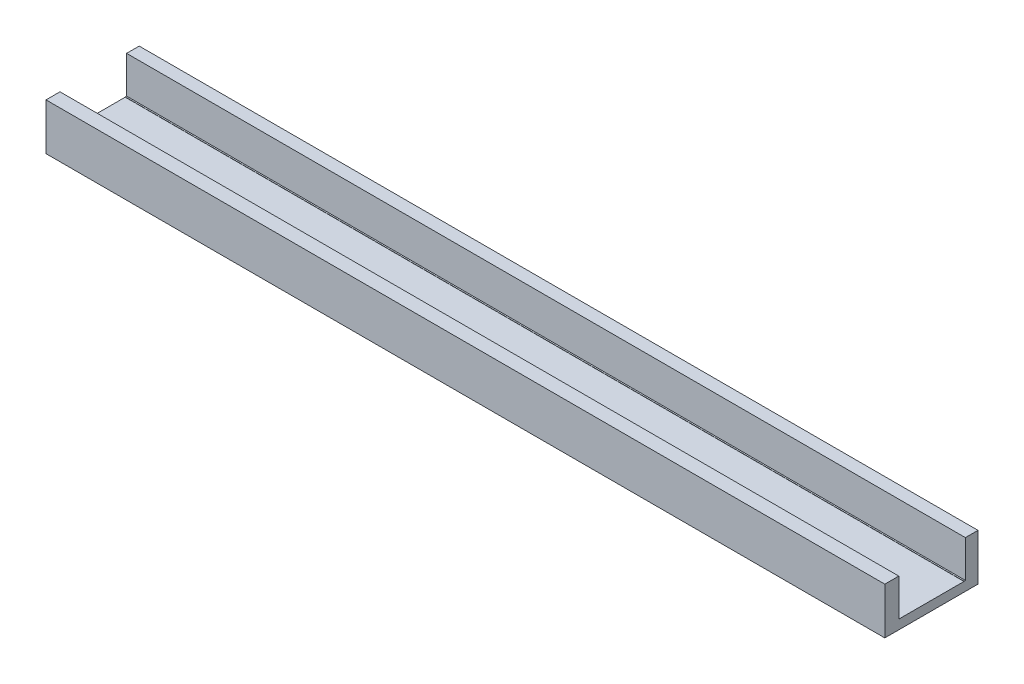
ISO-10303-21;
HEADER;
FILE_DESCRIPTION(('STEP AP214'),'2;1');
FILE_NAME('part.step','',(''),(''),'','','');
FILE_SCHEMA(('AUTOMOTIVE_DESIGN { 1 0 10303 214 1 1 1 1 }'));
ENDSEC;
DATA;
#1=APPLICATION_CONTEXT('core data for automotive mechanical design processes');
#2=APPLICATION_PROTOCOL_DEFINITION('international standard','automotive_design',2000,#1);
#3=PRODUCT_CONTEXT('',#1,'mechanical');
#4=PRODUCT('Part','Part','',(#3));
#5=PRODUCT_RELATED_PRODUCT_CATEGORY('part','',(#4));
#6=PRODUCT_DEFINITION_FORMATION('','',#4);
#7=PRODUCT_DEFINITION_CONTEXT('part definition',#1,'design');
#8=PRODUCT_DEFINITION('design','',#6,#7);
#9=PRODUCT_DEFINITION_SHAPE('','',#8);
#10=(LENGTH_UNIT() NAMED_UNIT(*) SI_UNIT(.MILLI.,.METRE.));
#11=(NAMED_UNIT(*) PLANE_ANGLE_UNIT() SI_UNIT($,.RADIAN.));
#12=(NAMED_UNIT(*) SI_UNIT($,.STERADIAN.) SOLID_ANGLE_UNIT());
#13=UNCERTAINTY_MEASURE_WITH_UNIT(LENGTH_MEASURE(1.E-05),#10,'distance_accuracy_value','');
#14=(GEOMETRIC_REPRESENTATION_CONTEXT(3) GLOBAL_UNCERTAINTY_ASSIGNED_CONTEXT((#13)) GLOBAL_UNIT_ASSIGNED_CONTEXT((#10,
#11,#12)) REPRESENTATION_CONTEXT('',''));
#15=CARTESIAN_POINT('',(0.,0.,0.));
#16=DIRECTION('',(0.,0.,1.));
#17=DIRECTION('',(1.,0.,0.));
#18=AXIS2_PLACEMENT_3D('',#15,#16,#17);
#19=CARTESIAN_POINT('',(-900.,-80.,30.));
#20=DIRECTION('',(0.,0.,-1.));
#21=DIRECTION('',(-1.,0.,0.));
#22=AXIS2_PLACEMENT_3D('',#19,#20,#21);
#23=PLANE('',#22);
#24=DIRECTION('',(1.,0.,0.));
#25=VECTOR('',#24,1.);
#26=CARTESIAN_POINT('',(0.,-79.5,30.));
#27=LINE('',#26,#25);
#28=CARTESIAN_POINT('',(-900.,-79.5,30.));
#29=VERTEX_POINT('',#28);
#30=CARTESIAN_POINT('',(900.,-79.5,30.));
#31=VERTEX_POINT('',#30);
#32=EDGE_CURVE('E126',#29,#31,#27,.T.);
#33=ORIENTED_EDGE('',*,*,#32,.F.);
#34=DIRECTION('',(0.,1.,0.));
#35=VECTOR('',#34,1.);
#36=CARTESIAN_POINT('',(-900.,-80.,30.));
#37=LINE('',#36,#35);
#38=CARTESIAN_POINT('',(-900.,-80.,30.));
#39=VERTEX_POINT('',#38);
#40=EDGE_CURVE('E152',#39,#29,#37,.T.);
#41=ORIENTED_EDGE('',*,*,#40,.F.);
#42=DIRECTION('',(-1.,0.,0.));
#43=VECTOR('',#42,1.);
#44=CARTESIAN_POINT('',(-900.,-80.,30.));
#45=LINE('',#44,#43);
#46=CARTESIAN_POINT('',(900.,-80.,30.));
#47=VERTEX_POINT('',#46);
#48=EDGE_CURVE('E60',#47,#39,#45,.T.);
#49=ORIENTED_EDGE('',*,*,#48,.F.);
#50=DIRECTION('',(0.,1.,0.));
#51=VECTOR('',#50,1.);
#52=CARTESIAN_POINT('',(900.,-80.,30.));
#53=LINE('',#52,#51);
#54=EDGE_CURVE('E156',#47,#31,#53,.T.);
#55=ORIENTED_EDGE('',*,*,#54,.T.);
#56=EDGE_LOOP('',(#33,#41,#49,#55));
#57=FACE_BOUND('',#56,.T.);
#58=ADVANCED_FACE('F37',(#57),#23,.F.);
#59=CARTESIAN_POINT('',(900.,0.,200.));
#60=DIRECTION('',(0.,-1.,0.));
#61=DIRECTION('',(0.,0.,-1.));
#62=AXIS2_PLACEMENT_3D('',#59,#60,#61);
#63=PLANE('',#62);
#64=DIRECTION('',(0.,0.,-1.));
#65=VECTOR('',#64,1.);
#66=CARTESIAN_POINT('',(-900.,0.,200.));
#67=LINE('',#66,#65);
#68=CARTESIAN_POINT('',(-900.,0.,27.0585267238108));
#69=VERTEX_POINT('',#68);
#70=CARTESIAN_POINT('',(-900.,0.,0.));
#71=VERTEX_POINT('',#70);
#72=EDGE_CURVE('E183',#69,#71,#67,.T.);
#73=ORIENTED_EDGE('',*,*,#72,.F.);
#74=DIRECTION('',(-1.,0.,0.));
#75=VECTOR('',#74,1.);
#76=CARTESIAN_POINT('',(0.,0.,27.0585267238108));
#77=LINE('',#76,#75);
#78=CARTESIAN_POINT('',(900.,0.,27.0585267238108));
#79=VERTEX_POINT('',#78);
#80=EDGE_CURVE('E130',#79,#69,#77,.T.);
#81=ORIENTED_EDGE('',*,*,#80,.F.);
#82=DIRECTION('',(0.,0.,-1.));
#83=VECTOR('',#82,1.);
#84=CARTESIAN_POINT('',(900.,0.,200.));
#85=LINE('',#84,#83);
#86=CARTESIAN_POINT('',(900.,0.,0.));
#87=VERTEX_POINT('',#86);
#88=EDGE_CURVE('E135',#79,#87,#85,.T.);
#89=ORIENTED_EDGE('',*,*,#88,.T.);
#90=DIRECTION('',(-1.,0.,0.));
#91=VECTOR('',#90,1.);
#92=CARTESIAN_POINT('',(900.,0.,0.));
#93=LINE('',#92,#91);
#94=EDGE_CURVE('E177',#87,#71,#93,.T.);
#95=ORIENTED_EDGE('',*,*,#94,.T.);
#96=EDGE_LOOP('',(#73,#81,#89,#95));
#97=FACE_BOUND('',#96,.T.);
#98=ADVANCED_FACE('F193',(#97),#63,.F.);
#99=CARTESIAN_POINT('',(-900.,-100.,200.));
#100=DIRECTION('',(0.,1.,0.));
#101=DIRECTION('',(-1.,0.,0.));
#102=AXIS2_PLACEMENT_3D('',#99,#100,#101);
#103=PLANE('',#102);
#104=DIRECTION('',(1.,0.,0.));
#105=VECTOR('',#104,1.);
#106=CARTESIAN_POINT('',(-900.,-100.,0.));
#107=LINE('',#106,#105);
#108=CARTESIAN_POINT('',(-900.,-100.,0.));
#109=VERTEX_POINT('',#108);
#110=CARTESIAN_POINT('',(900.,-99.9999999999997,0.));
#111=VERTEX_POINT('',#110);
#112=EDGE_CURVE('E155',#109,#111,#107,.T.);
#113=ORIENTED_EDGE('',*,*,#112,.T.);
#114=DIRECTION('',(0.,0.,-1.));
#115=VECTOR('',#114,1.);
#116=CARTESIAN_POINT('',(900.,-99.9999999999997,200.));
#117=LINE('',#116,#115);
#118=CARTESIAN_POINT('',(900.,-99.9999999999997,200.));
#119=VERTEX_POINT('',#118);
#120=EDGE_CURVE('E11',#119,#111,#117,.T.);
#121=ORIENTED_EDGE('',*,*,#120,.F.);
#122=DIRECTION('',(1.,0.,0.));
#123=VECTOR('',#122,1.);
#124=CARTESIAN_POINT('',(-900.,-100.,200.));
#125=LINE('',#124,#123);
#126=CARTESIAN_POINT('',(-900.,-100.,200.));
#127=VERTEX_POINT('',#126);
#128=EDGE_CURVE('E162',#127,#119,#125,.T.);
#129=ORIENTED_EDGE('',*,*,#128,.F.);
#130=DIRECTION('',(0.,0.,-1.));
#131=VECTOR('',#130,1.);
#132=CARTESIAN_POINT('',(-900.,-100.,200.));
#133=LINE('',#132,#131);
#134=EDGE_CURVE('E172',#127,#109,#133,.T.);
#135=ORIENTED_EDGE('',*,*,#134,.T.);
#136=EDGE_LOOP('',(#113,#121,#129,#135));
#137=FACE_BOUND('',#136,.T.);
#138=ADVANCED_FACE('F39',(#137),#103,.F.);
#139=CARTESIAN_POINT('',(900.,-99.9999999999997,200.));
#140=DIRECTION('',(-1.,0.,0.));
#141=DIRECTION('',(0.,0.,1.));
#142=AXIS2_PLACEMENT_3D('',#139,#140,#141);
#143=PLANE('',#142);
#144=ORIENTED_EDGE('',*,*,#88,.F.);
#145=DIRECTION('',(0.,1.,0.));
#146=VECTOR('',#145,1.);
#147=CARTESIAN_POINT('',(900.,-79.5,27.0585267238108));
#148=LINE('',#147,#146);
#149=CARTESIAN_POINT('',(900.,-79.5,27.0585267238108));
#150=VERTEX_POINT('',#149);
#151=EDGE_CURVE('E118',#150,#79,#148,.T.);
#152=ORIENTED_EDGE('',*,*,#151,.F.);
#153=DIRECTION('',(0.,0.,-1.));
#154=VECTOR('',#153,1.);
#155=CARTESIAN_POINT('',(900.,-79.5,0.));
#156=LINE('',#155,#154);
#157=EDGE_CURVE('E122',#31,#150,#156,.T.);
#158=ORIENTED_EDGE('',*,*,#157,.F.);
#159=ORIENTED_EDGE('',*,*,#54,.F.);
#160=DIRECTION('',(0.,0.,-1.));
#161=VECTOR('',#160,1.);
#162=CARTESIAN_POINT('',(900.,-80.,30.));
#163=LINE('',#162,#161);
#164=CARTESIAN_POINT('',(900.,-80.,170.));
#165=VERTEX_POINT('',#164);
#166=EDGE_CURVE('E147',#165,#47,#163,.T.);
#167=ORIENTED_EDGE('',*,*,#166,.F.);
#168=DIRECTION('',(0.,1.,0.));
#169=VECTOR('',#168,1.);
#170=CARTESIAN_POINT('',(900.,-80.,170.));
#171=LINE('',#170,#169);
#172=CARTESIAN_POINT('',(900.,0.,170.));
#173=VERTEX_POINT('',#172);
#174=EDGE_CURVE('E158',#165,#173,#171,.T.);
#175=ORIENTED_EDGE('',*,*,#174,.T.);
#176=CARTESIAN_POINT('',(900.,0.,200.));
#177=VERTEX_POINT('',#176);
#178=EDGE_CURVE('E45',#177,#173,#85,.T.);
#179=ORIENTED_EDGE('',*,*,#178,.F.);
#180=DIRECTION('',(0.,1.,0.));
#181=VECTOR('',#180,1.);
#182=CARTESIAN_POINT('',(900.,-99.9999999999997,200.));
#183=LINE('',#182,#181);
#184=EDGE_CURVE('E165',#119,#177,#183,.T.);
#185=ORIENTED_EDGE('',*,*,#184,.F.);
#186=ORIENTED_EDGE('',*,*,#120,.T.);
#187=DIRECTION('',(0.,1.,0.));
#188=VECTOR('',#187,1.);
#189=CARTESIAN_POINT('',(900.,-99.9999999999997,0.));
#190=LINE('',#189,#188);
#191=EDGE_CURVE('E175',#111,#87,#190,.T.);
#192=ORIENTED_EDGE('',*,*,#191,.T.);
#193=EDGE_LOOP('',(#144,#152,#158,#159,#167,#175,#179,#185,#186,#192));
#194=FACE_BOUND('',#193,.T.);
#195=ADVANCED_FACE('F133',(#194),#143,.F.);
#196=ORIENTED_EDGE('',*,*,#178,.T.);
#197=DIRECTION('',(1.,0.,0.));
#198=VECTOR('',#197,1.);
#199=CARTESIAN_POINT('',(-900.,0.,170.));
#200=LINE('',#199,#198);
#201=CARTESIAN_POINT('',(-900.,0.,170.));
#202=VERTEX_POINT('',#201);
#203=EDGE_CURVE('E137',#202,#173,#200,.T.);
#204=ORIENTED_EDGE('',*,*,#203,.F.);
#205=CARTESIAN_POINT('',(-900.,0.,200.));
#206=VERTEX_POINT('',#205);
#207=EDGE_CURVE('E184',#206,#202,#67,.T.);
#208=ORIENTED_EDGE('',*,*,#207,.F.);
#209=DIRECTION('',(-1.,0.,0.));
#210=VECTOR('',#209,1.);
#211=CARTESIAN_POINT('',(900.,0.,200.));
#212=LINE('',#211,#210);
#213=EDGE_CURVE('E168',#177,#206,#212,.T.);
#214=ORIENTED_EDGE('',*,*,#213,.F.);
#215=EDGE_LOOP('',(#196,#204,#208,#214));
#216=FACE_BOUND('',#215,.T.);
#217=ADVANCED_FACE('F211',(#216),#63,.F.);
#218=CARTESIAN_POINT('',(-900.,0.,200.));
#219=DIRECTION('',(1.,0.,0.));
#220=DIRECTION('',(0.,0.,-1.));
#221=AXIS2_PLACEMENT_3D('',#218,#219,#220);
#222=PLANE('',#221);
#223=DIRECTION('',(0.,0.,1.));
#224=VECTOR('',#223,1.);
#225=CARTESIAN_POINT('',(-900.,-79.5,0.));
#226=LINE('',#225,#224);
#227=CARTESIAN_POINT('',(-900.,-79.5,27.0585267238108));
#228=VERTEX_POINT('',#227);
#229=EDGE_CURVE('E52',#228,#29,#226,.T.);
#230=ORIENTED_EDGE('',*,*,#229,.F.);
#231=DIRECTION('',(0.,1.,0.));
#232=VECTOR('',#231,1.);
#233=CARTESIAN_POINT('',(-900.,-79.5,27.0585267238108));
#234=LINE('',#233,#232);
#235=EDGE_CURVE('E121',#228,#69,#234,.T.);
#236=ORIENTED_EDGE('',*,*,#235,.T.);
#237=ORIENTED_EDGE('',*,*,#72,.T.);
#238=DIRECTION('',(0.,-1.,0.));
#239=VECTOR('',#238,1.);
#240=CARTESIAN_POINT('',(-900.,0.,0.));
#241=LINE('',#240,#239);
#242=EDGE_CURVE('E166',#71,#109,#241,.T.);
#243=ORIENTED_EDGE('',*,*,#242,.T.);
#244=ORIENTED_EDGE('',*,*,#134,.F.);
#245=DIRECTION('',(0.,-1.,0.));
#246=VECTOR('',#245,1.);
#247=CARTESIAN_POINT('',(-900.,0.,200.));
#248=LINE('',#247,#246);
#249=EDGE_CURVE('E170',#206,#127,#248,.T.);
#250=ORIENTED_EDGE('',*,*,#249,.F.);
#251=ORIENTED_EDGE('',*,*,#207,.T.);
#252=DIRECTION('',(0.,1.,0.));
#253=VECTOR('',#252,1.);
#254=CARTESIAN_POINT('',(-900.,-80.,170.));
#255=LINE('',#254,#253);
#256=CARTESIAN_POINT('',(-900.,-80.,170.));
#257=VERTEX_POINT('',#256);
#258=EDGE_CURVE('E150',#257,#202,#255,.T.);
#259=ORIENTED_EDGE('',*,*,#258,.F.);
#260=DIRECTION('',(0.,0.,1.));
#261=VECTOR('',#260,1.);
#262=CARTESIAN_POINT('',(-900.,-80.,30.));
#263=LINE('',#262,#261);
#264=EDGE_CURVE('E142',#39,#257,#263,.T.);
#265=ORIENTED_EDGE('',*,*,#264,.F.);
#266=ORIENTED_EDGE('',*,*,#40,.T.);
#267=EDGE_LOOP('',(#230,#236,#237,#243,#244,#250,#251,#259,#265,#266));
#268=FACE_BOUND('',#267,.T.);
#269=ADVANCED_FACE('F202',(#268),#222,.F.);
#270=CARTESIAN_POINT('',(0.,0.,200.));
#271=DIRECTION('',(0.,0.,1.));
#272=DIRECTION('',(1.,0.,0.));
#273=AXIS2_PLACEMENT_3D('',#270,#271,#272);
#274=PLANE('',#273);
#275=ORIENTED_EDGE('',*,*,#128,.T.);
#276=ORIENTED_EDGE('',*,*,#184,.T.);
#277=ORIENTED_EDGE('',*,*,#213,.T.);
#278=ORIENTED_EDGE('',*,*,#249,.T.);
#279=EDGE_LOOP('',(#275,#276,#277,#278));
#280=FACE_BOUND('',#279,.T.);
#281=ADVANCED_FACE('F207',(#280),#274,.T.);
#282=CARTESIAN_POINT('',(0.,0.,0.));
#283=DIRECTION('',(0.,0.,1.));
#284=DIRECTION('',(1.,0.,0.));
#285=AXIS2_PLACEMENT_3D('',#282,#283,#284);
#286=PLANE('',#285);
#287=ORIENTED_EDGE('',*,*,#112,.F.);
#288=ORIENTED_EDGE('',*,*,#242,.F.);
#289=ORIENTED_EDGE('',*,*,#94,.F.);
#290=ORIENTED_EDGE('',*,*,#191,.F.);
#291=EDGE_LOOP('',(#287,#288,#289,#290));
#292=FACE_BOUND('',#291,.T.);
#293=ADVANCED_FACE('F199',(#292),#286,.F.);
#294=CARTESIAN_POINT('',(-900.,-80.,170.));
#295=DIRECTION('',(0.,0.,1.));
#296=DIRECTION('',(1.,0.,0.));
#297=AXIS2_PLACEMENT_3D('',#294,#295,#296);
#298=PLANE('',#297);
#299=ORIENTED_EDGE('',*,*,#203,.T.);
#300=ORIENTED_EDGE('',*,*,#174,.F.);
#301=DIRECTION('',(1.,0.,0.));
#302=VECTOR('',#301,1.);
#303=CARTESIAN_POINT('',(-900.,-80.,170.));
#304=LINE('',#303,#302);
#305=EDGE_CURVE('E144',#257,#165,#304,.T.);
#306=ORIENTED_EDGE('',*,*,#305,.F.);
#307=ORIENTED_EDGE('',*,*,#258,.T.);
#308=EDGE_LOOP('',(#299,#300,#306,#307));
#309=FACE_BOUND('',#308,.T.);
#310=ADVANCED_FACE('F213',(#309),#298,.F.);
#311=CARTESIAN_POINT('',(0.,-80.,0.));
#312=DIRECTION('',(0.,1.,0.));
#313=DIRECTION('',(0.,0.,1.));
#314=AXIS2_PLACEMENT_3D('',#311,#312,#313);
#315=PLANE('',#314);
#316=ORIENTED_EDGE('',*,*,#264,.T.);
#317=ORIENTED_EDGE('',*,*,#305,.T.);
#318=ORIENTED_EDGE('',*,*,#166,.T.);
#319=ORIENTED_EDGE('',*,*,#48,.T.);
#320=EDGE_LOOP('',(#316,#317,#318,#319));
#321=FACE_BOUND('',#320,.T.);
#322=ADVANCED_FACE('F215',(#321),#315,.T.);
#323=CARTESIAN_POINT('',(0.,-79.5,27.0585267238108));
#324=DIRECTION('',(0.,0.,-1.));
#325=DIRECTION('',(-1.,0.,0.));
#326=AXIS2_PLACEMENT_3D('',#323,#324,#325);
#327=PLANE('',#326);
#328=ORIENTED_EDGE('',*,*,#80,.T.);
#329=ORIENTED_EDGE('',*,*,#235,.F.);
#330=DIRECTION('',(-1.,0.,0.));
#331=VECTOR('',#330,1.);
#332=CARTESIAN_POINT('',(0.,-79.5,27.0585267238108));
#333=LINE('',#332,#331);
#334=EDGE_CURVE('E114',#150,#228,#333,.T.);
#335=ORIENTED_EDGE('',*,*,#334,.F.);
#336=ORIENTED_EDGE('',*,*,#151,.T.);
#337=EDGE_LOOP('',(#328,#329,#335,#336));
#338=FACE_BOUND('',#337,.T.);
#339=ADVANCED_FACE('F116',(#338),#327,.F.);
#340=CARTESIAN_POINT('',(0.,-79.5,0.));
#341=DIRECTION('',(0.,1.,0.));
#342=DIRECTION('',(0.,0.,1.));
#343=AXIS2_PLACEMENT_3D('',#340,#341,#342);
#344=PLANE('',#343);
#345=ORIENTED_EDGE('',*,*,#157,.T.);
#346=ORIENTED_EDGE('',*,*,#334,.T.);
#347=ORIENTED_EDGE('',*,*,#229,.T.);
#348=ORIENTED_EDGE('',*,*,#32,.T.);
#349=EDGE_LOOP('',(#345,#346,#347,#348));
#350=FACE_BOUND('',#349,.T.);
#351=ADVANCED_FACE('F125',(#350),#344,.T.);
#352=CLOSED_SHELL('',(#58,#98,#138,#195,#217,#269,#281,#293,#310,#322,#339,#351));
#353=MANIFOLD_SOLID_BREP('B2',#352);
#354=ADVANCED_BREP_SHAPE_REPRESENTATION('',(#18,#353),#14);
#355=SHAPE_DEFINITION_REPRESENTATION(#9,#354);
ENDSEC;
END-ISO-10303-21;
